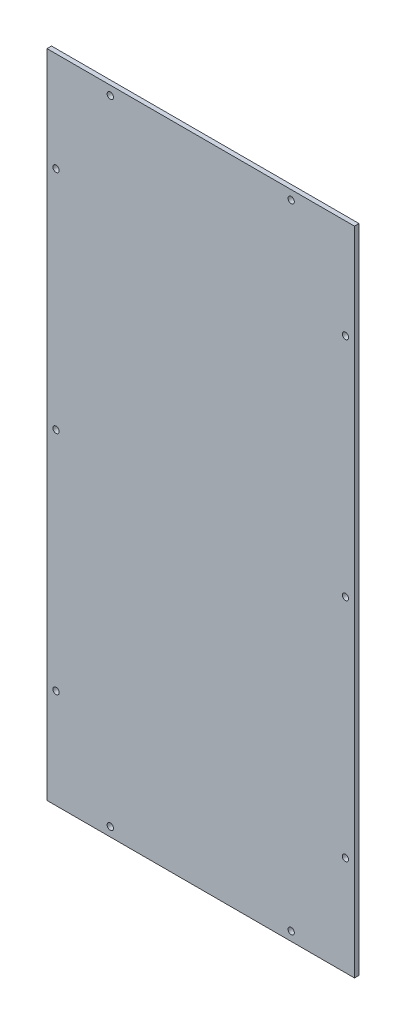
ISO-10303-21;
HEADER;
FILE_DESCRIPTION(('STEP AP214'),'2;1');
FILE_NAME('part.step','',(''),(''),'','','');
FILE_SCHEMA(('AUTOMOTIVE_DESIGN { 1 0 10303 214 1 1 1 1 }'));
ENDSEC;
DATA;
#1=APPLICATION_CONTEXT('core data for automotive mechanical design processes');
#2=APPLICATION_PROTOCOL_DEFINITION('international standard','automotive_design',2000,#1);
#3=PRODUCT_CONTEXT('',#1,'mechanical');
#4=PRODUCT('Part','Part','',(#3));
#5=PRODUCT_RELATED_PRODUCT_CATEGORY('part','',(#4));
#6=PRODUCT_DEFINITION_FORMATION('','',#4);
#7=PRODUCT_DEFINITION_CONTEXT('part definition',#1,'design');
#8=PRODUCT_DEFINITION('design','',#6,#7);
#9=PRODUCT_DEFINITION_SHAPE('','',#8);
#10=(LENGTH_UNIT() NAMED_UNIT(*) SI_UNIT(.MILLI.,.METRE.));
#11=(NAMED_UNIT(*) PLANE_ANGLE_UNIT() SI_UNIT($,.RADIAN.));
#12=(NAMED_UNIT(*) SI_UNIT($,.STERADIAN.) SOLID_ANGLE_UNIT());
#13=UNCERTAINTY_MEASURE_WITH_UNIT(LENGTH_MEASURE(1.E-05),#10,'distance_accuracy_value','');
#14=(GEOMETRIC_REPRESENTATION_CONTEXT(3) GLOBAL_UNCERTAINTY_ASSIGNED_CONTEXT((#13)) GLOBAL_UNIT_ASSIGNED_CONTEXT((#10,
#11,#12)) REPRESENTATION_CONTEXT('',''));
#15=CARTESIAN_POINT('',(0.,0.,0.));
#16=DIRECTION('',(0.,0.,1.));
#17=DIRECTION('',(1.,0.,0.));
#18=AXIS2_PLACEMENT_3D('',#15,#16,#17);
#19=CARTESIAN_POINT('',(0.,0.,-2.5));
#20=DIRECTION('',(0.,0.,-1.));
#21=DIRECTION('',(-1.,0.,0.));
#22=AXIS2_PLACEMENT_3D('',#19,#20,#21);
#23=PLANE('',#22);
#24=CARTESIAN_POINT('',(160.,-250.,-2.5));
#25=DIRECTION('',(0.,0.,-1.));
#26=DIRECTION('',(-1.,0.,0.));
#27=AXIS2_PLACEMENT_3D('',#24,#25,#26);
#28=CIRCLE('',#27,3.49999999999999);
#29=CARTESIAN_POINT('',(156.5,-250.,-2.5));
#30=VERTEX_POINT('',#29);
#31=EDGE_CURVE('E189',#30,#30,#28,.T.);
#32=ORIENTED_EDGE('',*,*,#31,.F.);
#33=EDGE_LOOP('',(#32));
#34=FACE_BOUND('',#33,.T.);
#35=CARTESIAN_POINT('',(160.,250.,-2.5));
#36=DIRECTION('',(0.,0.,-1.));
#37=DIRECTION('',(1.,0.,0.));
#38=AXIS2_PLACEMENT_3D('',#35,#36,#37);
#39=CIRCLE('',#38,3.49999999999999);
#40=CARTESIAN_POINT('',(163.5,250.,-2.5));
#41=VERTEX_POINT('',#40);
#42=EDGE_CURVE('E193',#41,#41,#39,.T.);
#43=ORIENTED_EDGE('',*,*,#42,.F.);
#44=EDGE_LOOP('',(#43));
#45=FACE_BOUND('',#44,.T.);
#46=CARTESIAN_POINT('',(159.999999999998,-6.10622663543836E-13,-2.5));
#47=DIRECTION('',(0.,0.,-1.));
#48=DIRECTION('',(1.,0.,0.));
#49=AXIS2_PLACEMENT_3D('',#46,#47,#48);
#50=CIRCLE('',#49,3.49999999999999);
#51=CARTESIAN_POINT('',(163.499999999998,-6.10622663543836E-13,-2.5));
#52=VERTEX_POINT('',#51);
#53=EDGE_CURVE('E197',#52,#52,#50,.T.);
#54=ORIENTED_EDGE('',*,*,#53,.F.);
#55=EDGE_LOOP('',(#54));
#56=FACE_BOUND('',#55,.T.);
#57=CARTESIAN_POINT('',(99.9999999999999,-350.000000000001,-2.5));
#58=DIRECTION('',(0.,0.,-1.));
#59=DIRECTION('',(-1.,0.,0.));
#60=AXIS2_PLACEMENT_3D('',#57,#58,#59);
#61=CIRCLE('',#60,3.50000000001378);
#62=CARTESIAN_POINT('',(96.4999999999861,-350.000000000001,-2.5));
#63=VERTEX_POINT('',#62);
#64=EDGE_CURVE('E201',#63,#63,#61,.T.);
#65=ORIENTED_EDGE('',*,*,#64,.F.);
#66=EDGE_LOOP('',(#65));
#67=FACE_BOUND('',#66,.T.);
#68=CARTESIAN_POINT('',(-160.,-250.,-2.5));
#69=DIRECTION('',(0.,0.,-1.));
#70=DIRECTION('',(1.,0.,0.));
#71=AXIS2_PLACEMENT_3D('',#68,#69,#70);
#72=CIRCLE('',#71,3.49999999999999);
#73=CARTESIAN_POINT('',(-156.5,-250.,-2.5));
#74=VERTEX_POINT('',#73);
#75=EDGE_CURVE('E205',#74,#74,#72,.T.);
#76=ORIENTED_EDGE('',*,*,#75,.F.);
#77=EDGE_LOOP('',(#76));
#78=FACE_BOUND('',#77,.T.);
#79=CARTESIAN_POINT('',(-160.,250.,-2.5));
#80=DIRECTION('',(0.,0.,-1.));
#81=DIRECTION('',(-1.,0.,0.));
#82=AXIS2_PLACEMENT_3D('',#79,#80,#81);
#83=CIRCLE('',#82,3.49999999999999);
#84=CARTESIAN_POINT('',(-163.5,250.,-2.5));
#85=VERTEX_POINT('',#84);
#86=EDGE_CURVE('E209',#85,#85,#83,.T.);
#87=ORIENTED_EDGE('',*,*,#86,.F.);
#88=EDGE_LOOP('',(#87));
#89=FACE_BOUND('',#88,.T.);
#90=CARTESIAN_POINT('',(-100.,350.,-2.5));
#91=DIRECTION('',(0.,0.,-1.));
#92=DIRECTION('',(-1.,0.,0.));
#93=AXIS2_PLACEMENT_3D('',#90,#91,#92);
#94=CIRCLE('',#93,3.50000000000001);
#95=CARTESIAN_POINT('',(-103.5,350.,-2.5));
#96=VERTEX_POINT('',#95);
#97=EDGE_CURVE('E213',#96,#96,#94,.T.);
#98=ORIENTED_EDGE('',*,*,#97,.F.);
#99=EDGE_LOOP('',(#98));
#100=FACE_BOUND('',#99,.T.);
#101=CARTESIAN_POINT('',(99.9999999999999,350.,-2.5));
#102=DIRECTION('',(0.,0.,-1.));
#103=DIRECTION('',(1.,0.,0.));
#104=AXIS2_PLACEMENT_3D('',#101,#102,#103);
#105=CIRCLE('',#104,3.50000000000001);
#106=CARTESIAN_POINT('',(103.5,350.,-2.5));
#107=VERTEX_POINT('',#106);
#108=EDGE_CURVE('E217',#107,#107,#105,.T.);
#109=ORIENTED_EDGE('',*,*,#108,.F.);
#110=EDGE_LOOP('',(#109));
#111=FACE_BOUND('',#110,.T.);
#112=CARTESIAN_POINT('',(-100.,-350.000000000001,-2.5));
#113=DIRECTION('',(0.,0.,-1.));
#114=DIRECTION('',(1.,0.,0.));
#115=AXIS2_PLACEMENT_3D('',#112,#113,#114);
#116=CIRCLE('',#115,3.49999999998021);
#117=CARTESIAN_POINT('',(-96.5000000000199,-350.000000000001,-2.5));
#118=VERTEX_POINT('',#117);
#119=EDGE_CURVE('E221',#118,#118,#116,.T.);
#120=ORIENTED_EDGE('',*,*,#119,.F.);
#121=EDGE_LOOP('',(#120));
#122=FACE_BOUND('',#121,.T.);
#123=CARTESIAN_POINT('',(-160.,2.77555756156289E-13,-2.5));
#124=DIRECTION('',(0.,0.,-1.));
#125=DIRECTION('',(-1.,0.,0.));
#126=AXIS2_PLACEMENT_3D('',#123,#124,#125);
#127=CIRCLE('',#126,3.49999999999999);
#128=CARTESIAN_POINT('',(-163.5,2.77555756156289E-13,-2.5));
#129=VERTEX_POINT('',#128);
#130=EDGE_CURVE('E120',#129,#129,#127,.T.);
#131=ORIENTED_EDGE('',*,*,#130,.F.);
#132=EDGE_LOOP('',(#131));
#133=FACE_BOUND('',#132,.T.);
#134=DIRECTION('',(0.,1.,0.));
#135=VECTOR('',#134,1.);
#136=CARTESIAN_POINT('',(170.,-360.,-2.5));
#137=LINE('',#136,#135);
#138=CARTESIAN_POINT('',(170.,360.,-2.5));
#139=VERTEX_POINT('',#138);
#140=CARTESIAN_POINT('',(170.,-360.,-2.5));
#141=VERTEX_POINT('',#140);
#142=EDGE_CURVE('E101',#139,#141,#137,.F.);
#143=ORIENTED_EDGE('',*,*,#142,.T.);
#144=DIRECTION('',(1.,0.,0.));
#145=VECTOR('',#144,1.);
#146=CARTESIAN_POINT('',(-170.,-360.,-2.5));
#147=LINE('',#146,#145);
#148=CARTESIAN_POINT('',(-170.,-360.,-2.5));
#149=VERTEX_POINT('',#148);
#150=EDGE_CURVE('E92',#141,#149,#147,.F.);
#151=ORIENTED_EDGE('',*,*,#150,.T.);
#152=DIRECTION('',(0.,1.,0.));
#153=VECTOR('',#152,1.);
#154=CARTESIAN_POINT('',(-170.,-360.,-2.5));
#155=LINE('',#154,#153);
#156=CARTESIAN_POINT('',(-170.,360.,-2.5));
#157=VERTEX_POINT('',#156);
#158=EDGE_CURVE('E86',#149,#157,#155,.T.);
#159=ORIENTED_EDGE('',*,*,#158,.T.);
#160=DIRECTION('',(1.,0.,0.));
#161=VECTOR('',#160,1.);
#162=CARTESIAN_POINT('',(-170.,360.,-2.5));
#163=LINE('',#162,#161);
#164=EDGE_CURVE('E104',#157,#139,#163,.T.);
#165=ORIENTED_EDGE('',*,*,#164,.T.);
#166=EDGE_LOOP('',(#143,#151,#159,#165));
#167=FACE_BOUND('',#166,.T.);
#168=ADVANCED_FACE('F44',(#34,#45,#56,#67,#78,#89,#100,#111,#122,#133,#167),#23,.T.);
#169=CARTESIAN_POINT('',(170.,-360.,2.5));
#170=DIRECTION('',(-1.,0.,0.));
#171=DIRECTION('',(0.,0.,1.));
#172=AXIS2_PLACEMENT_3D('',#169,#170,#171);
#173=PLANE('',#172);
#174=DIRECTION('',(0.,1.,0.));
#175=VECTOR('',#174,1.);
#176=CARTESIAN_POINT('',(170.,0.,2.5));
#177=LINE('',#176,#175);
#178=CARTESIAN_POINT('',(170.,360.,2.5));
#179=VERTEX_POINT('',#178);
#180=CARTESIAN_POINT('',(170.,-360.,2.5));
#181=VERTEX_POINT('',#180);
#182=EDGE_CURVE('E111',#179,#181,#177,.F.);
#183=ORIENTED_EDGE('',*,*,#182,.T.);
#184=DIRECTION('',(0.,0.,1.));
#185=VECTOR('',#184,1.);
#186=CARTESIAN_POINT('',(170.,-360.,2.5));
#187=LINE('',#186,#185);
#188=EDGE_CURVE('E97',#181,#141,#187,.F.);
#189=ORIENTED_EDGE('',*,*,#188,.T.);
#190=ORIENTED_EDGE('',*,*,#142,.F.);
#191=DIRECTION('',(0.,0.,-1.));
#192=VECTOR('',#191,1.);
#193=CARTESIAN_POINT('',(170.,360.,2.5));
#194=LINE('',#193,#192);
#195=EDGE_CURVE('E235',#139,#179,#194,.F.);
#196=ORIENTED_EDGE('',*,*,#195,.T.);
#197=EDGE_LOOP('',(#183,#189,#190,#196));
#198=FACE_BOUND('',#197,.T.);
#199=ADVANCED_FACE('F110',(#198),#173,.F.);
#200=CARTESIAN_POINT('',(-170.,-360.,2.5));
#201=DIRECTION('',(0.,1.,0.));
#202=DIRECTION('',(0.,0.,1.));
#203=AXIS2_PLACEMENT_3D('',#200,#201,#202);
#204=PLANE('',#203);
#205=DIRECTION('',(-1.,0.,0.));
#206=VECTOR('',#205,1.);
#207=CARTESIAN_POINT('',(0.,-360.,2.5));
#208=LINE('',#207,#206);
#209=CARTESIAN_POINT('',(-170.,-360.,2.5));
#210=VERTEX_POINT('',#209);
#211=EDGE_CURVE('E231',#181,#210,#208,.T.);
#212=ORIENTED_EDGE('',*,*,#211,.T.);
#213=DIRECTION('',(0.,0.,-1.));
#214=VECTOR('',#213,1.);
#215=CARTESIAN_POINT('',(-170.,-360.,2.5));
#216=LINE('',#215,#214);
#217=EDGE_CURVE('E99',#210,#149,#216,.T.);
#218=ORIENTED_EDGE('',*,*,#217,.T.);
#219=ORIENTED_EDGE('',*,*,#150,.F.);
#220=ORIENTED_EDGE('',*,*,#188,.F.);
#221=EDGE_LOOP('',(#212,#218,#219,#220));
#222=FACE_BOUND('',#221,.T.);
#223=ADVANCED_FACE('F95',(#222),#204,.F.);
#224=CARTESIAN_POINT('',(-170.,-360.,2.5));
#225=DIRECTION('',(1.,0.,0.));
#226=DIRECTION('',(0.,0.,-1.));
#227=AXIS2_PLACEMENT_3D('',#224,#225,#226);
#228=PLANE('',#227);
#229=DIRECTION('',(0.,1.,0.));
#230=VECTOR('',#229,1.);
#231=CARTESIAN_POINT('',(-170.,0.,2.5));
#232=LINE('',#231,#230);
#233=CARTESIAN_POINT('',(-170.,360.,2.5));
#234=VERTEX_POINT('',#233);
#235=EDGE_CURVE('E53',#210,#234,#232,.T.);
#236=ORIENTED_EDGE('',*,*,#235,.T.);
#237=DIRECTION('',(0.,0.,-1.));
#238=VECTOR('',#237,1.);
#239=CARTESIAN_POINT('',(-170.,360.,2.5));
#240=LINE('',#239,#238);
#241=EDGE_CURVE('E63',#234,#157,#240,.T.);
#242=ORIENTED_EDGE('',*,*,#241,.T.);
#243=ORIENTED_EDGE('',*,*,#158,.F.);
#244=ORIENTED_EDGE('',*,*,#217,.F.);
#245=EDGE_LOOP('',(#236,#242,#243,#244));
#246=FACE_BOUND('',#245,.T.);
#247=ADVANCED_FACE('F173',(#246),#228,.F.);
#248=CARTESIAN_POINT('',(-170.,360.,2.5));
#249=DIRECTION('',(0.,-1.,0.));
#250=DIRECTION('',(0.,0.,-1.));
#251=AXIS2_PLACEMENT_3D('',#248,#249,#250);
#252=PLANE('',#251);
#253=DIRECTION('',(-1.,0.,0.));
#254=VECTOR('',#253,1.);
#255=CARTESIAN_POINT('',(0.,360.,2.5));
#256=LINE('',#255,#254);
#257=EDGE_CURVE('E11',#234,#179,#256,.F.);
#258=ORIENTED_EDGE('',*,*,#257,.T.);
#259=ORIENTED_EDGE('',*,*,#195,.F.);
#260=ORIENTED_EDGE('',*,*,#164,.F.);
#261=ORIENTED_EDGE('',*,*,#241,.F.);
#262=EDGE_LOOP('',(#258,#259,#260,#261));
#263=FACE_BOUND('',#262,.T.);
#264=ADVANCED_FACE('F164',(#263),#252,.F.);
#265=CARTESIAN_POINT('',(0.,0.,2.5));
#266=DIRECTION('',(0.,0.,-1.));
#267=DIRECTION('',(-1.,0.,0.));
#268=AXIS2_PLACEMENT_3D('',#265,#266,#267);
#269=PLANE('',#268);
#270=CARTESIAN_POINT('',(160.,-250.,2.5));
#271=DIRECTION('',(0.,0.,-1.));
#272=DIRECTION('',(-1.,0.,0.));
#273=AXIS2_PLACEMENT_3D('',#270,#271,#272);
#274=CIRCLE('',#273,3.49999999999999);
#275=CARTESIAN_POINT('',(156.5,-250.,2.5));
#276=VERTEX_POINT('',#275);
#277=EDGE_CURVE('E47',#276,#276,#274,.T.);
#278=ORIENTED_EDGE('',*,*,#277,.T.);
#279=EDGE_LOOP('',(#278));
#280=FACE_BOUND('',#279,.T.);
#281=CARTESIAN_POINT('',(160.,250.,2.5));
#282=DIRECTION('',(0.,0.,-1.));
#283=DIRECTION('',(-1.,0.,0.));
#284=AXIS2_PLACEMENT_3D('',#281,#282,#283);
#285=CIRCLE('',#284,3.49999999999999);
#286=CARTESIAN_POINT('',(156.5,250.,2.5));
#287=VERTEX_POINT('',#286);
#288=EDGE_CURVE('E140',#287,#287,#285,.T.);
#289=ORIENTED_EDGE('',*,*,#288,.T.);
#290=EDGE_LOOP('',(#289));
#291=FACE_BOUND('',#290,.T.);
#292=CARTESIAN_POINT('',(159.999999999998,-6.10622663543836E-13,2.5));
#293=DIRECTION('',(0.,0.,-1.));
#294=DIRECTION('',(-1.,0.,0.));
#295=AXIS2_PLACEMENT_3D('',#292,#293,#294);
#296=CIRCLE('',#295,3.49999999999999);
#297=CARTESIAN_POINT('',(156.499999999998,-6.10622663543836E-13,2.5));
#298=VERTEX_POINT('',#297);
#299=EDGE_CURVE('E138',#298,#298,#296,.T.);
#300=ORIENTED_EDGE('',*,*,#299,.T.);
#301=EDGE_LOOP('',(#300));
#302=FACE_BOUND('',#301,.T.);
#303=CARTESIAN_POINT('',(99.9999999999999,-350.000000000001,2.5));
#304=DIRECTION('',(0.,0.,-1.));
#305=DIRECTION('',(-1.,0.,0.));
#306=AXIS2_PLACEMENT_3D('',#303,#304,#305);
#307=CIRCLE('',#306,3.50000000001378);
#308=CARTESIAN_POINT('',(96.4999999999861,-350.000000000001,2.5));
#309=VERTEX_POINT('',#308);
#310=EDGE_CURVE('E135',#309,#309,#307,.T.);
#311=ORIENTED_EDGE('',*,*,#310,.T.);
#312=EDGE_LOOP('',(#311));
#313=FACE_BOUND('',#312,.T.);
#314=CARTESIAN_POINT('',(-160.,-250.,2.5));
#315=DIRECTION('',(0.,0.,-1.));
#316=DIRECTION('',(-1.,0.,0.));
#317=AXIS2_PLACEMENT_3D('',#314,#315,#316);
#318=CIRCLE('',#317,3.49999999999999);
#319=CARTESIAN_POINT('',(-163.5,-250.,2.5));
#320=VERTEX_POINT('',#319);
#321=EDGE_CURVE('E132',#320,#320,#318,.T.);
#322=ORIENTED_EDGE('',*,*,#321,.T.);
#323=EDGE_LOOP('',(#322));
#324=FACE_BOUND('',#323,.T.);
#325=CARTESIAN_POINT('',(-160.,250.,2.5));
#326=DIRECTION('',(0.,0.,-1.));
#327=DIRECTION('',(-1.,0.,0.));
#328=AXIS2_PLACEMENT_3D('',#325,#326,#327);
#329=CIRCLE('',#328,3.49999999999999);
#330=CARTESIAN_POINT('',(-163.5,250.,2.5));
#331=VERTEX_POINT('',#330);
#332=EDGE_CURVE('E129',#331,#331,#329,.T.);
#333=ORIENTED_EDGE('',*,*,#332,.T.);
#334=EDGE_LOOP('',(#333));
#335=FACE_BOUND('',#334,.T.);
#336=CARTESIAN_POINT('',(-100.,350.,2.5));
#337=DIRECTION('',(0.,0.,-1.));
#338=DIRECTION('',(-1.,0.,0.));
#339=AXIS2_PLACEMENT_3D('',#336,#337,#338);
#340=CIRCLE('',#339,3.50000000000001);
#341=CARTESIAN_POINT('',(-103.5,350.,2.5));
#342=VERTEX_POINT('',#341);
#343=EDGE_CURVE('E126',#342,#342,#340,.T.);
#344=ORIENTED_EDGE('',*,*,#343,.T.);
#345=EDGE_LOOP('',(#344));
#346=FACE_BOUND('',#345,.T.);
#347=CARTESIAN_POINT('',(99.9999999999999,350.,2.5));
#348=DIRECTION('',(0.,0.,-1.));
#349=DIRECTION('',(-1.,0.,0.));
#350=AXIS2_PLACEMENT_3D('',#347,#348,#349);
#351=CIRCLE('',#350,3.50000000000001);
#352=CARTESIAN_POINT('',(96.4999999999999,350.,2.5));
#353=VERTEX_POINT('',#352);
#354=EDGE_CURVE('E123',#353,#353,#351,.T.);
#355=ORIENTED_EDGE('',*,*,#354,.T.);
#356=EDGE_LOOP('',(#355));
#357=FACE_BOUND('',#356,.T.);
#358=CARTESIAN_POINT('',(-100.,-350.000000000001,2.5));
#359=DIRECTION('',(0.,0.,-1.));
#360=DIRECTION('',(-1.,0.,0.));
#361=AXIS2_PLACEMENT_3D('',#358,#359,#360);
#362=CIRCLE('',#361,3.49999999998021);
#363=CARTESIAN_POINT('',(-103.49999999998,-350.000000000001,2.5));
#364=VERTEX_POINT('',#363);
#365=EDGE_CURVE('E119',#364,#364,#362,.T.);
#366=ORIENTED_EDGE('',*,*,#365,.T.);
#367=EDGE_LOOP('',(#366));
#368=FACE_BOUND('',#367,.T.);
#369=CARTESIAN_POINT('',(-160.,2.77555756156289E-13,2.5));
#370=DIRECTION('',(0.,0.,-1.));
#371=DIRECTION('',(-1.,0.,0.));
#372=AXIS2_PLACEMENT_3D('',#369,#370,#371);
#373=CIRCLE('',#372,3.49999999999999);
#374=CARTESIAN_POINT('',(-163.5,2.77555756156289E-13,2.5));
#375=VERTEX_POINT('',#374);
#376=EDGE_CURVE('E116',#375,#375,#373,.T.);
#377=ORIENTED_EDGE('',*,*,#376,.T.);
#378=EDGE_LOOP('',(#377));
#379=FACE_BOUND('',#378,.T.);
#380=ORIENTED_EDGE('',*,*,#235,.F.);
#381=ORIENTED_EDGE('',*,*,#211,.F.);
#382=ORIENTED_EDGE('',*,*,#182,.F.);
#383=ORIENTED_EDGE('',*,*,#257,.F.);
#384=EDGE_LOOP('',(#380,#381,#382,#383));
#385=FACE_BOUND('',#384,.T.);
#386=ADVANCED_FACE('F147',(#280,#291,#302,#313,#324,#335,#346,#357,#368,#379,#385),#269,.F.);
#387=CARTESIAN_POINT('',(-160.,2.77555756156289E-13,7.5));
#388=DIRECTION('',(0.,0.,-1.));
#389=DIRECTION('',(-1.,0.,0.));
#390=AXIS2_PLACEMENT_3D('',#387,#388,#389);
#391=CYLINDRICAL_SURFACE('',#390,3.49999999999999);
#392=ORIENTED_EDGE('',*,*,#130,.T.);
#393=EDGE_LOOP('',(#392));
#394=FACE_BOUND('',#393,.T.);
#395=ORIENTED_EDGE('',*,*,#376,.F.);
#396=EDGE_LOOP('',(#395));
#397=FACE_BOUND('',#396,.T.);
#398=ADVANCED_FACE('F163',(#394,#397),#391,.F.);
#399=CARTESIAN_POINT('',(-100.,-350.000000000001,7.5));
#400=DIRECTION('',(0.,0.,-1.));
#401=DIRECTION('',(-1.,0.,0.));
#402=AXIS2_PLACEMENT_3D('',#399,#400,#401);
#403=CYLINDRICAL_SURFACE('',#402,3.49999999998021);
#404=ORIENTED_EDGE('',*,*,#119,.T.);
#405=EDGE_LOOP('',(#404));
#406=FACE_BOUND('',#405,.T.);
#407=ORIENTED_EDGE('',*,*,#365,.F.);
#408=EDGE_LOOP('',(#407));
#409=FACE_BOUND('',#408,.T.);
#410=ADVANCED_FACE('F170',(#406,#409),#403,.F.);
#411=CARTESIAN_POINT('',(99.9999999999999,350.,7.5));
#412=DIRECTION('',(0.,0.,-1.));
#413=DIRECTION('',(-1.,0.,0.));
#414=AXIS2_PLACEMENT_3D('',#411,#412,#413);
#415=CYLINDRICAL_SURFACE('',#414,3.50000000000001);
#416=ORIENTED_EDGE('',*,*,#108,.T.);
#417=EDGE_LOOP('',(#416));
#418=FACE_BOUND('',#417,.T.);
#419=ORIENTED_EDGE('',*,*,#354,.F.);
#420=EDGE_LOOP('',(#419));
#421=FACE_BOUND('',#420,.T.);
#422=ADVANCED_FACE('F248',(#418,#421),#415,.F.);
#423=CARTESIAN_POINT('',(-100.,350.,7.5));
#424=DIRECTION('',(0.,0.,-1.));
#425=DIRECTION('',(-1.,0.,0.));
#426=AXIS2_PLACEMENT_3D('',#423,#424,#425);
#427=CYLINDRICAL_SURFACE('',#426,3.50000000000001);
#428=ORIENTED_EDGE('',*,*,#97,.T.);
#429=EDGE_LOOP('',(#428));
#430=FACE_BOUND('',#429,.T.);
#431=ORIENTED_EDGE('',*,*,#343,.F.);
#432=EDGE_LOOP('',(#431));
#433=FACE_BOUND('',#432,.T.);
#434=ADVANCED_FACE('F258',(#430,#433),#427,.F.);
#435=CARTESIAN_POINT('',(-160.,250.,7.5));
#436=DIRECTION('',(0.,0.,-1.));
#437=DIRECTION('',(-1.,0.,0.));
#438=AXIS2_PLACEMENT_3D('',#435,#436,#437);
#439=CYLINDRICAL_SURFACE('',#438,3.49999999999999);
#440=ORIENTED_EDGE('',*,*,#86,.T.);
#441=EDGE_LOOP('',(#440));
#442=FACE_BOUND('',#441,.T.);
#443=ORIENTED_EDGE('',*,*,#332,.F.);
#444=EDGE_LOOP('',(#443));
#445=FACE_BOUND('',#444,.T.);
#446=ADVANCED_FACE('F271',(#442,#445),#439,.F.);
#447=CARTESIAN_POINT('',(-160.,-250.,7.5));
#448=DIRECTION('',(0.,0.,-1.));
#449=DIRECTION('',(-1.,0.,0.));
#450=AXIS2_PLACEMENT_3D('',#447,#448,#449);
#451=CYLINDRICAL_SURFACE('',#450,3.49999999999999);
#452=ORIENTED_EDGE('',*,*,#75,.T.);
#453=EDGE_LOOP('',(#452));
#454=FACE_BOUND('',#453,.T.);
#455=ORIENTED_EDGE('',*,*,#321,.F.);
#456=EDGE_LOOP('',(#455));
#457=FACE_BOUND('',#456,.T.);
#458=ADVANCED_FACE('F266',(#454,#457),#451,.F.);
#459=CARTESIAN_POINT('',(99.9999999999999,-350.000000000001,7.5));
#460=DIRECTION('',(0.,0.,-1.));
#461=DIRECTION('',(-1.,0.,0.));
#462=AXIS2_PLACEMENT_3D('',#459,#460,#461);
#463=CYLINDRICAL_SURFACE('',#462,3.50000000001378);
#464=ORIENTED_EDGE('',*,*,#64,.T.);
#465=EDGE_LOOP('',(#464));
#466=FACE_BOUND('',#465,.T.);
#467=ORIENTED_EDGE('',*,*,#310,.F.);
#468=EDGE_LOOP('',(#467));
#469=FACE_BOUND('',#468,.T.);
#470=ADVANCED_FACE('F263',(#466,#469),#463,.F.);
#471=CARTESIAN_POINT('',(159.999999999998,-6.10622663543836E-13,7.5));
#472=DIRECTION('',(0.,0.,-1.));
#473=DIRECTION('',(-1.,0.,0.));
#474=AXIS2_PLACEMENT_3D('',#471,#472,#473);
#475=CYLINDRICAL_SURFACE('',#474,3.49999999999999);
#476=ORIENTED_EDGE('',*,*,#53,.T.);
#477=EDGE_LOOP('',(#476));
#478=FACE_BOUND('',#477,.T.);
#479=ORIENTED_EDGE('',*,*,#299,.F.);
#480=EDGE_LOOP('',(#479));
#481=FACE_BOUND('',#480,.T.);
#482=ADVANCED_FACE('F157',(#478,#481),#475,.F.);
#483=CARTESIAN_POINT('',(160.,250.,7.5));
#484=DIRECTION('',(0.,0.,-1.));
#485=DIRECTION('',(-1.,0.,0.));
#486=AXIS2_PLACEMENT_3D('',#483,#484,#485);
#487=CYLINDRICAL_SURFACE('',#486,3.49999999999999);
#488=ORIENTED_EDGE('',*,*,#42,.T.);
#489=EDGE_LOOP('',(#488));
#490=FACE_BOUND('',#489,.T.);
#491=ORIENTED_EDGE('',*,*,#288,.F.);
#492=EDGE_LOOP('',(#491));
#493=FACE_BOUND('',#492,.T.);
#494=ADVANCED_FACE('F151',(#490,#493),#487,.F.);
#495=CARTESIAN_POINT('',(160.,-250.,7.5));
#496=DIRECTION('',(0.,0.,-1.));
#497=DIRECTION('',(-1.,0.,0.));
#498=AXIS2_PLACEMENT_3D('',#495,#496,#497);
#499=CYLINDRICAL_SURFACE('',#498,3.49999999999999);
#500=ORIENTED_EDGE('',*,*,#31,.T.);
#501=EDGE_LOOP('',(#500));
#502=FACE_BOUND('',#501,.T.);
#503=ORIENTED_EDGE('',*,*,#277,.F.);
#504=EDGE_LOOP('',(#503));
#505=FACE_BOUND('',#504,.T.);
#506=ADVANCED_FACE('F149',(#502,#505),#499,.F.);
#507=CLOSED_SHELL('',(#168,#199,#223,#247,#264,#386,#398,#410,#422,#434,#446,#458,#470,#482,
#494,#506));
#508=MANIFOLD_SOLID_BREP('B2',#507);
#509=ADVANCED_BREP_SHAPE_REPRESENTATION('',(#18,#508),#14);
#510=SHAPE_DEFINITION_REPRESENTATION(#9,#509);
ENDSEC;
END-ISO-10303-21;
